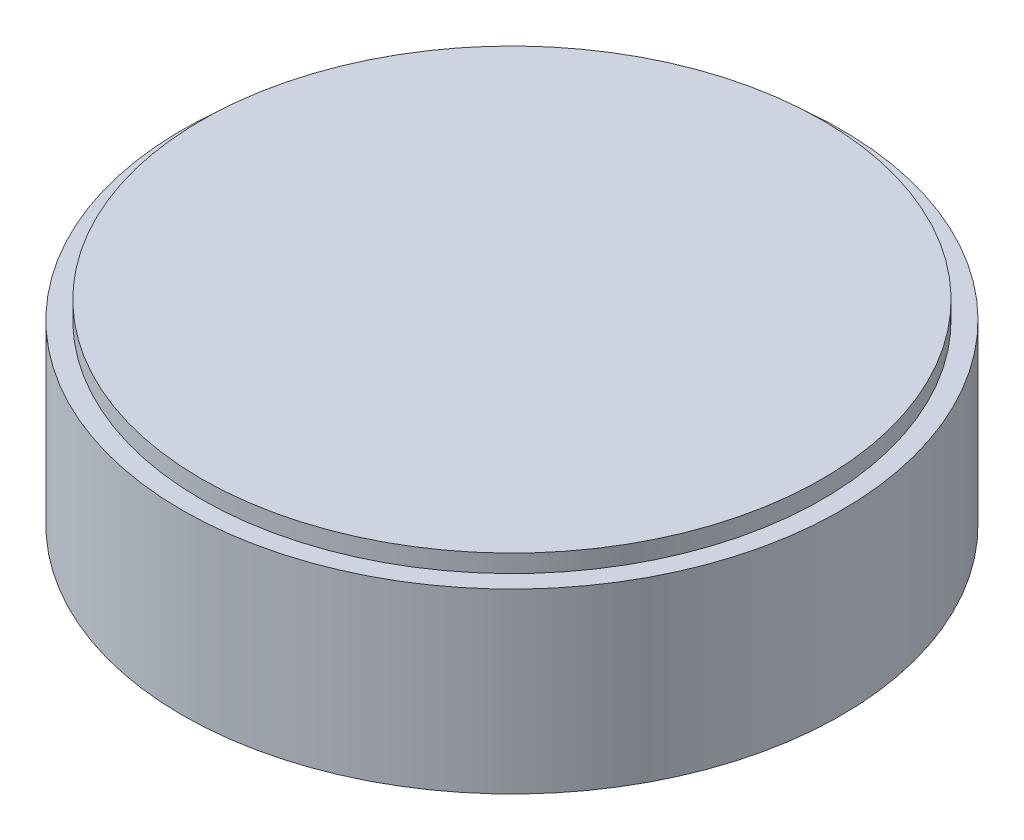
ISO-10303-21;
HEADER;
FILE_DESCRIPTION(('STEP AP214'),'2;1');
FILE_NAME('part.step','',(''),(''),'','','');
FILE_SCHEMA(('AUTOMOTIVE_DESIGN { 1 0 10303 214 1 1 1 1 }'));
ENDSEC;
DATA;
#1=APPLICATION_CONTEXT('core data for automotive mechanical design processes');
#2=APPLICATION_PROTOCOL_DEFINITION('international standard','automotive_design',2000,#1);
#3=PRODUCT_CONTEXT('',#1,'mechanical');
#4=PRODUCT('Part','Part','',(#3));
#5=PRODUCT_RELATED_PRODUCT_CATEGORY('part','',(#4));
#6=PRODUCT_DEFINITION_FORMATION('','',#4);
#7=PRODUCT_DEFINITION_CONTEXT('part definition',#1,'design');
#8=PRODUCT_DEFINITION('design','',#6,#7);
#9=PRODUCT_DEFINITION_SHAPE('','',#8);
#10=(LENGTH_UNIT() NAMED_UNIT(*) SI_UNIT(.MILLI.,.METRE.));
#11=(NAMED_UNIT(*) PLANE_ANGLE_UNIT() SI_UNIT($,.RADIAN.));
#12=(NAMED_UNIT(*) SI_UNIT($,.STERADIAN.) SOLID_ANGLE_UNIT());
#13=UNCERTAINTY_MEASURE_WITH_UNIT(LENGTH_MEASURE(1.E-05),#10,'distance_accuracy_value','');
#14=(GEOMETRIC_REPRESENTATION_CONTEXT(3) GLOBAL_UNCERTAINTY_ASSIGNED_CONTEXT((#13)) GLOBAL_UNIT_ASSIGNED_CONTEXT((#10,
#11,#12)) REPRESENTATION_CONTEXT('',''));
#15=CARTESIAN_POINT('',(0.,0.,0.));
#16=DIRECTION('',(0.,0.,1.));
#17=DIRECTION('',(1.,0.,0.));
#18=AXIS2_PLACEMENT_3D('',#15,#16,#17);
#19=CARTESIAN_POINT('',(-8.05555037796249,11.,-10.7407338372833));
#20=DIRECTION('',(0.,-1.,0.));
#21=DIRECTION('',(0.,0.,-1.));
#22=AXIS2_PLACEMENT_3D('',#19,#20,#21);
#23=CYLINDRICAL_SURFACE('',#22,17.5);
#24=CARTESIAN_POINT('',(-8.05555037796249,11.,-10.7407338372833));
#25=DIRECTION('',(0.,1.,0.));
#26=DIRECTION('',(0.,0.,1.));
#27=AXIS2_PLACEMENT_3D('',#24,#25,#26);
#28=CIRCLE('',#27,17.5);
#29=CARTESIAN_POINT('',(-8.05555037796249,11.,6.75926616271665));
#30=VERTEX_POINT('',#29);
#31=EDGE_CURVE('E11',#30,#30,#28,.T.);
#32=ORIENTED_EDGE('',*,*,#31,.F.);
#33=EDGE_LOOP('',(#32));
#34=FACE_BOUND('',#33,.T.);
#35=CARTESIAN_POINT('',(-8.05555037796249,10.,-10.7407338372833));
#36=DIRECTION('',(0.,1.,0.));
#37=DIRECTION('',(0.,0.,1.));
#38=AXIS2_PLACEMENT_3D('',#35,#36,#37);
#39=CIRCLE('',#38,17.5);
#40=CARTESIAN_POINT('',(-8.05555037796249,10.,6.75926616271665));
#41=VERTEX_POINT('',#40);
#42=EDGE_CURVE('E42',#41,#41,#39,.T.);
#43=ORIENTED_EDGE('',*,*,#42,.T.);
#44=EDGE_LOOP('',(#43));
#45=FACE_BOUND('',#44,.T.);
#46=ADVANCED_FACE('F39',(#34,#45),#23,.T.);
#47=CARTESIAN_POINT('',(-8.05555037796249,11.,-10.7407338372833));
#48=DIRECTION('',(0.,1.,0.));
#49=DIRECTION('',(0.,0.,1.));
#50=AXIS2_PLACEMENT_3D('',#47,#48,#49);
#51=PLANE('',#50);
#52=ORIENTED_EDGE('',*,*,#31,.T.);
#53=EDGE_LOOP('',(#52));
#54=FACE_BOUND('',#53,.T.);
#55=ADVANCED_FACE('F54',(#54),#51,.T.);
#56=CARTESIAN_POINT('',(-8.05555037796249,10.,-10.7407338372833));
#57=DIRECTION('',(0.,1.,0.));
#58=DIRECTION('',(0.,0.,1.));
#59=AXIS2_PLACEMENT_3D('',#56,#57,#58);
#60=PLANE('',#59);
#61=ORIENTED_EDGE('',*,*,#42,.F.);
#62=EDGE_LOOP('',(#61));
#63=FACE_BOUND('',#62,.T.);
#64=ADVANCED_FACE('F52',(#63),#60,.F.);
#65=CLOSED_SHELL('',(#46,#55,#64));
#66=MANIFOLD_SOLID_BREP('B2',#65);
#67=CARTESIAN_POINT('',(-8.05555037796249,10.,-10.7407338372833));
#68=DIRECTION('',(0.,1.,0.));
#69=DIRECTION('',(0.,0.,1.));
#70=AXIS2_PLACEMENT_3D('',#67,#68,#69);
#71=PLANE('',#70);
#72=CARTESIAN_POINT('',(-8.05555037796249,10.,-10.7407338372833));
#73=DIRECTION('',(0.,1.,0.));
#74=DIRECTION('',(0.,0.,1.));
#75=AXIS2_PLACEMENT_3D('',#72,#73,#74);
#76=CIRCLE('',#75,18.5728215330816);
#77=CARTESIAN_POINT('',(-8.05555037796249,10.,7.83208769579824));
#78=VERTEX_POINT('',#77);
#79=EDGE_CURVE('E38',#78,#78,#76,.T.);
#80=ORIENTED_EDGE('',*,*,#79,.T.);
#81=EDGE_LOOP('',(#80));
#82=FACE_BOUND('',#81,.T.);
#83=CARTESIAN_POINT('',(-8.05555037796249,10.,-10.7407338372833));
#84=DIRECTION('',(0.,1.,0.));
#85=DIRECTION('',(0.,0.,1.));
#86=AXIS2_PLACEMENT_3D('',#83,#84,#85);
#87=CIRCLE('',#86,17.5);
#88=CARTESIAN_POINT('',(-8.05555037796249,10.,6.75926616271665));
#89=VERTEX_POINT('',#88);
#90=EDGE_CURVE('E91',#89,#89,#87,.T.);
#91=ORIENTED_EDGE('',*,*,#90,.F.);
#92=EDGE_LOOP('',(#91));
#93=FACE_BOUND('',#92,.T.);
#94=ADVANCED_FACE('F80',(#82,#93),#71,.T.);
#95=CARTESIAN_POINT('',(-8.05555037796249,0.,-10.7407338372833));
#96=DIRECTION('',(0.,1.,0.));
#97=DIRECTION('',(0.,0.,1.));
#98=AXIS2_PLACEMENT_3D('',#95,#96,#97);
#99=PLANE('',#98);
#100=CARTESIAN_POINT('',(-8.05555037796249,0.,-10.7407338372833));
#101=DIRECTION('',(0.,1.,0.));
#102=DIRECTION('',(0.,0.,1.));
#103=AXIS2_PLACEMENT_3D('',#100,#101,#102);
#104=CIRCLE('',#103,18.5728215330816);
#105=CARTESIAN_POINT('',(-8.05555037796249,0.,7.83208769579824));
#106=VERTEX_POINT('',#105);
#107=EDGE_CURVE('E84',#106,#106,#104,.T.);
#108=ORIENTED_EDGE('',*,*,#107,.F.);
#109=EDGE_LOOP('',(#108));
#110=FACE_BOUND('',#109,.T.);
#111=CARTESIAN_POINT('',(-8.05555037796249,0.,-10.7407338372833));
#112=DIRECTION('',(0.,1.,0.));
#113=DIRECTION('',(0.,0.,1.));
#114=AXIS2_PLACEMENT_3D('',#111,#112,#113);
#115=CIRCLE('',#114,17.5);
#116=CARTESIAN_POINT('',(-8.05555037796249,0.,6.75926616271665));
#117=VERTEX_POINT('',#116);
#118=EDGE_CURVE('E93',#117,#117,#115,.T.);
#119=ORIENTED_EDGE('',*,*,#118,.T.);
#120=EDGE_LOOP('',(#119));
#121=FACE_BOUND('',#120,.T.);
#122=ADVANCED_FACE('F103',(#110,#121),#99,.F.);
#123=CARTESIAN_POINT('',(-8.05555037796249,10.,-10.7407338372833));
#124=DIRECTION('',(0.,-1.,0.));
#125=DIRECTION('',(0.,0.,-1.));
#126=AXIS2_PLACEMENT_3D('',#123,#124,#125);
#127=CYLINDRICAL_SURFACE('',#126,18.5728215330816);
#128=ORIENTED_EDGE('',*,*,#79,.F.);
#129=EDGE_LOOP('',(#128));
#130=FACE_BOUND('',#129,.T.);
#131=ORIENTED_EDGE('',*,*,#107,.T.);
#132=EDGE_LOOP('',(#131));
#133=FACE_BOUND('',#132,.T.);
#134=ADVANCED_FACE('F82',(#130,#133),#127,.T.);
#135=CARTESIAN_POINT('',(-8.05555037796249,10.,-10.7407338372833));
#136=DIRECTION('',(0.,-1.,0.));
#137=DIRECTION('',(0.,0.,-1.));
#138=AXIS2_PLACEMENT_3D('',#135,#136,#137);
#139=CYLINDRICAL_SURFACE('',#138,17.5);
#140=ORIENTED_EDGE('',*,*,#90,.T.);
#141=EDGE_LOOP('',(#140));
#142=FACE_BOUND('',#141,.T.);
#143=ORIENTED_EDGE('',*,*,#118,.F.);
#144=EDGE_LOOP('',(#143));
#145=FACE_BOUND('',#144,.T.);
#146=ADVANCED_FACE('F99',(#142,#145),#139,.F.);
#147=CLOSED_SHELL('',(#94,#122,#134,#146));
#148=MANIFOLD_SOLID_BREP('B6',#147);
#149=ADVANCED_BREP_SHAPE_REPRESENTATION('',(#18,#66,#148),#14);
#150=SHAPE_DEFINITION_REPRESENTATION(#9,#149);
ENDSEC;
END-ISO-10303-21;
